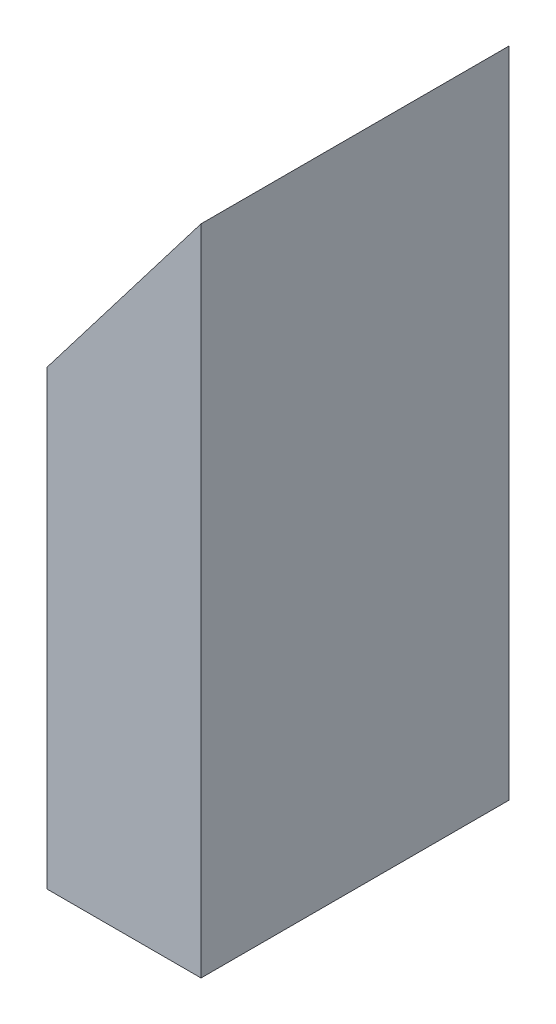
ISO-10303-21;
HEADER;
FILE_DESCRIPTION(('STEP AP214'),'2;1');
FILE_NAME('part.step','',(''),(''),'','','');
FILE_SCHEMA(('AUTOMOTIVE_DESIGN { 1 0 10303 214 1 1 1 1 }'));
ENDSEC;
DATA;
#1=APPLICATION_CONTEXT('core data for automotive mechanical design processes');
#2=APPLICATION_PROTOCOL_DEFINITION('international standard','automotive_design',2000,#1);
#3=PRODUCT_CONTEXT('',#1,'mechanical');
#4=PRODUCT('Part','Part','',(#3));
#5=PRODUCT_RELATED_PRODUCT_CATEGORY('part','',(#4));
#6=PRODUCT_DEFINITION_FORMATION('','',#4);
#7=PRODUCT_DEFINITION_CONTEXT('part definition',#1,'design');
#8=PRODUCT_DEFINITION('design','',#6,#7);
#9=PRODUCT_DEFINITION_SHAPE('','',#8);
#10=(LENGTH_UNIT() NAMED_UNIT(*) SI_UNIT(.MILLI.,.METRE.));
#11=(NAMED_UNIT(*) PLANE_ANGLE_UNIT() SI_UNIT($,.RADIAN.));
#12=(NAMED_UNIT(*) SI_UNIT($,.STERADIAN.) SOLID_ANGLE_UNIT());
#13=UNCERTAINTY_MEASURE_WITH_UNIT(LENGTH_MEASURE(1.E-05),#10,'distance_accuracy_value','');
#14=(GEOMETRIC_REPRESENTATION_CONTEXT(3) GLOBAL_UNCERTAINTY_ASSIGNED_CONTEXT((#13)) GLOBAL_UNIT_ASSIGNED_CONTEXT((#10,
#11,#12)) REPRESENTATION_CONTEXT('',''));
#15=CARTESIAN_POINT('',(0.,0.,0.));
#16=DIRECTION('',(0.,0.,1.));
#17=DIRECTION('',(1.,0.,0.));
#18=AXIS2_PLACEMENT_3D('',#15,#16,#17);
#19=CARTESIAN_POINT('',(-21.521207079583,25.2792878961904,25.4));
#20=DIRECTION('',(1.,0.,0.));
#21=DIRECTION('',(0.,1.,0.));
#22=AXIS2_PLACEMENT_3D('',#19,#20,#21);
#23=PLANE('',#22);
#24=DIRECTION('',(0.,-1.,0.));
#25=VECTOR('',#24,1.);
#26=CARTESIAN_POINT('',(-21.521207079583,25.2792878961904,0.));
#27=LINE('',#26,#25);
#28=CARTESIAN_POINT('',(-21.521207079583,25.2792878961904,0.));
#29=VERTEX_POINT('',#28);
#30=CARTESIAN_POINT('',(-21.521207079583,-11.9907870327744,0.));
#31=VERTEX_POINT('',#30);
#32=EDGE_CURVE('E114',#29,#31,#27,.T.);
#33=ORIENTED_EDGE('',*,*,#32,.T.);
#34=DIRECTION('',(0.,0.,-1.));
#35=VECTOR('',#34,1.);
#36=CARTESIAN_POINT('',(-21.521207079583,-11.9907870327744,25.4));
#37=LINE('',#36,#35);
#38=CARTESIAN_POINT('',(-21.521207079583,-11.9907870327744,25.4));
#39=VERTEX_POINT('',#38);
#40=EDGE_CURVE('E11',#39,#31,#37,.T.);
#41=ORIENTED_EDGE('',*,*,#40,.F.);
#42=DIRECTION('',(0.,-1.,0.));
#43=VECTOR('',#42,1.);
#44=CARTESIAN_POINT('',(-21.521207079583,25.2792878961904,25.4));
#45=LINE('',#44,#43);
#46=CARTESIAN_POINT('',(-21.521207079583,25.2792878961904,25.4));
#47=VERTEX_POINT('',#46);
#48=EDGE_CURVE('E115',#47,#39,#45,.T.);
#49=ORIENTED_EDGE('',*,*,#48,.F.);
#50=DIRECTION('',(0.,0.,-1.));
#51=VECTOR('',#50,1.);
#52=CARTESIAN_POINT('',(-21.521207079583,25.2792878961904,25.4));
#53=LINE('',#52,#51);
#54=EDGE_CURVE('E121',#47,#29,#53,.T.);
#55=ORIENTED_EDGE('',*,*,#54,.T.);
#56=EDGE_LOOP('',(#33,#41,#49,#55));
#57=FACE_BOUND('',#56,.T.);
#58=ADVANCED_FACE('F31',(#57),#23,.F.);
#59=CARTESIAN_POINT('',(-21.521207079583,-11.9907870327744,25.4));
#60=DIRECTION('',(0.,1.,0.));
#61=DIRECTION('',(0.,0.,1.));
#62=AXIS2_PLACEMENT_3D('',#59,#60,#61);
#63=PLANE('',#62);
#64=CARTESIAN_POINT('',(-15.1712070795824,-11.9907870327744,12.7));
#65=DIRECTION('',(0.,-1.,0.));
#66=DIRECTION('',(0.,0.,-1.));
#67=AXIS2_PLACEMENT_3D('',#64,#65,#66);
#68=CIRCLE('',#67,3.175);
#69=CARTESIAN_POINT('',(-15.1712070795824,-11.9907870327744,9.525));
#70=VERTEX_POINT('',#69);
#71=EDGE_CURVE('E95',#70,#70,#68,.T.);
#72=ORIENTED_EDGE('',*,*,#71,.F.);
#73=EDGE_LOOP('',(#72));
#74=FACE_BOUND('',#73,.T.);
#75=DIRECTION('',(1.,0.,0.));
#76=VECTOR('',#75,1.);
#77=CARTESIAN_POINT('',(-21.521207079583,-11.9907870327744,0.));
#78=LINE('',#77,#76);
#79=CARTESIAN_POINT('',(-8.81580759515179,-11.9907870327744,0.));
#80=VERTEX_POINT('',#79);
#81=EDGE_CURVE('E124',#31,#80,#78,.T.);
#82=ORIENTED_EDGE('',*,*,#81,.T.);
#83=DIRECTION('',(0.,0.,-1.));
#84=VECTOR('',#83,1.);
#85=CARTESIAN_POINT('',(-8.81580759515179,-11.9907870327744,25.4));
#86=LINE('',#85,#84);
#87=CARTESIAN_POINT('',(-8.81580759515179,-11.9907870327744,25.4));
#88=VERTEX_POINT('',#87);
#89=EDGE_CURVE('E39',#88,#80,#86,.T.);
#90=ORIENTED_EDGE('',*,*,#89,.F.);
#91=DIRECTION('',(1.,0.,0.));
#92=VECTOR('',#91,1.);
#93=CARTESIAN_POINT('',(-21.521207079583,-11.9907870327744,25.4));
#94=LINE('',#93,#92);
#95=EDGE_CURVE('E78',#39,#88,#94,.T.);
#96=ORIENTED_EDGE('',*,*,#95,.F.);
#97=ORIENTED_EDGE('',*,*,#40,.T.);
#98=EDGE_LOOP('',(#82,#90,#96,#97));
#99=FACE_BOUND('',#98,.T.);
#100=ADVANCED_FACE('F148',(#74,#99),#63,.F.);
#101=CARTESIAN_POINT('',(-8.81580759515179,-11.9907870327744,25.4));
#102=DIRECTION('',(-1.,0.,0.));
#103=DIRECTION('',(0.,-1.,0.));
#104=AXIS2_PLACEMENT_3D('',#101,#102,#103);
#105=PLANE('',#104);
#106=DIRECTION('',(0.,1.,0.));
#107=VECTOR('',#106,1.);
#108=CARTESIAN_POINT('',(-8.81580759515179,-11.9907870327744,0.));
#109=LINE('',#108,#107);
#110=CARTESIAN_POINT('',(-8.81580759515177,41.8792397509704,0.));
#111=VERTEX_POINT('',#110);
#112=EDGE_CURVE('E65',#80,#111,#109,.T.);
#113=ORIENTED_EDGE('',*,*,#112,.T.);
#114=DIRECTION('',(0.,0.,-1.));
#115=VECTOR('',#114,1.);
#116=CARTESIAN_POINT('',(-8.81580759515177,41.8792397509704,25.4));
#117=LINE('',#116,#115);
#118=CARTESIAN_POINT('',(-8.81580759515177,41.8792397509704,25.4));
#119=VERTEX_POINT('',#118);
#120=EDGE_CURVE('E129',#119,#111,#117,.T.);
#121=ORIENTED_EDGE('',*,*,#120,.F.);
#122=DIRECTION('',(0.,1.,0.));
#123=VECTOR('',#122,1.);
#124=CARTESIAN_POINT('',(-8.81580759515179,-11.9907870327744,25.4));
#125=LINE('',#124,#123);
#126=EDGE_CURVE('E118',#88,#119,#125,.T.);
#127=ORIENTED_EDGE('',*,*,#126,.F.);
#128=ORIENTED_EDGE('',*,*,#89,.T.);
#129=EDGE_LOOP('',(#113,#121,#127,#128));
#130=FACE_BOUND('',#129,.T.);
#131=ADVANCED_FACE('F131',(#130),#105,.F.);
#132=CARTESIAN_POINT('',(-8.81580759515177,41.8792397509704,25.4));
#133=DIRECTION('',(0.794096490407672,-0.607791710968666,0.));
#134=DIRECTION('',(0.607791710968666,0.794096490407672,0.));
#135=AXIS2_PLACEMENT_3D('',#132,#133,#134);
#136=PLANE('',#135);
#137=CARTESIAN_POINT('',(-16.1578182073802,32.2867021192637,12.7));
#138=DIRECTION('',(-0.794096490407672,0.607791710968666,0.));
#139=DIRECTION('',(-0.607791710968666,-0.794096490407672,0.));
#140=AXIS2_PLACEMENT_3D('',#137,#138,#139);
#141=CIRCLE('',#140,2.413);
#142=CARTESIAN_POINT('',(-17.6244196059475,30.3705472879099,12.7));
#143=VERTEX_POINT('',#142);
#144=EDGE_CURVE('E248',#143,#143,#141,.T.);
#145=ORIENTED_EDGE('',*,*,#144,.F.);
#146=EDGE_LOOP('',(#145));
#147=FACE_BOUND('',#146,.T.);
#148=DIRECTION('',(-0.607791710968666,-0.794096490407672,0.));
#149=VECTOR('',#148,1.);
#150=CARTESIAN_POINT('',(-8.81580759515177,41.8792397509704,0.));
#151=LINE('',#150,#149);
#152=EDGE_CURVE('E71',#111,#29,#151,.T.);
#153=ORIENTED_EDGE('',*,*,#152,.T.);
#154=ORIENTED_EDGE('',*,*,#54,.F.);
#155=DIRECTION('',(-0.607791710968666,-0.794096490407672,0.));
#156=VECTOR('',#155,1.);
#157=CARTESIAN_POINT('',(-8.81580759515177,41.8792397509704,25.4));
#158=LINE('',#157,#156);
#159=EDGE_CURVE('E47',#119,#47,#158,.T.);
#160=ORIENTED_EDGE('',*,*,#159,.F.);
#161=ORIENTED_EDGE('',*,*,#120,.T.);
#162=EDGE_LOOP('',(#153,#154,#160,#161));
#163=FACE_BOUND('',#162,.T.);
#164=ADVANCED_FACE('F138',(#147,#163),#136,.F.);
#165=CARTESIAN_POINT('',(-21.521207079583,-11.9907870327744,25.4));
#166=DIRECTION('',(0.,0.,1.));
#167=DIRECTION('',(1.,0.,0.));
#168=AXIS2_PLACEMENT_3D('',#165,#166,#167);
#169=PLANE('',#168);
#170=ORIENTED_EDGE('',*,*,#48,.T.);
#171=ORIENTED_EDGE('',*,*,#95,.T.);
#172=ORIENTED_EDGE('',*,*,#126,.T.);
#173=ORIENTED_EDGE('',*,*,#159,.T.);
#174=EDGE_LOOP('',(#170,#171,#172,#173));
#175=FACE_BOUND('',#174,.T.);
#176=ADVANCED_FACE('F140',(#175),#169,.T.);
#177=CARTESIAN_POINT('',(-21.521207079583,-11.9907870327744,0.));
#178=DIRECTION('',(0.,0.,1.));
#179=DIRECTION('',(1.,0.,0.));
#180=AXIS2_PLACEMENT_3D('',#177,#178,#179);
#181=PLANE('',#180);
#182=ORIENTED_EDGE('',*,*,#32,.F.);
#183=ORIENTED_EDGE('',*,*,#152,.F.);
#184=ORIENTED_EDGE('',*,*,#112,.F.);
#185=ORIENTED_EDGE('',*,*,#81,.F.);
#186=EDGE_LOOP('',(#182,#183,#184,#185));
#187=FACE_BOUND('',#186,.T.);
#188=ADVANCED_FACE('F134',(#187),#181,.F.);
#189=CARTESIAN_POINT('',(-15.1712070795824,4.51921296722563,12.7));
#190=DIRECTION('',(0.,-1.,0.));
#191=DIRECTION('',(0.,0.,-1.));
#192=AXIS2_PLACEMENT_3D('',#189,#190,#191);
#193=CONICAL_SURFACE('',#192,2.55269999999999,1.02974425867665);
#194=CARTESIAN_POINT('',(-15.1712070795824,6.05302986941728,12.7));
#195=VERTEX_POINT('',#194);
#196=VERTEX_LOOP('',#195);
#197=FACE_BOUND('',#196,.T.);
#198=CARTESIAN_POINT('',(-15.1712070795824,4.51921296722563,12.7));
#199=DIRECTION('',(0.,-1.,0.));
#200=DIRECTION('',(0.,0.,-1.));
#201=AXIS2_PLACEMENT_3D('',#198,#199,#200);
#202=CIRCLE('',#201,2.55269999999999);
#203=CARTESIAN_POINT('',(-15.1712070795824,4.51921296722563,10.1473));
#204=VERTEX_POINT('',#203);
#205=EDGE_CURVE('E111',#204,#204,#202,.T.);
#206=ORIENTED_EDGE('',*,*,#205,.T.);
#207=EDGE_LOOP('',(#206));
#208=FACE_BOUND('',#207,.T.);
#209=ADVANCED_FACE('F176',(#197,#208),#193,.F.);
#210=CARTESIAN_POINT('',(-15.1712070795824,-11.9907870327744,12.7));
#211=DIRECTION('',(0.,-1.,0.));
#212=DIRECTION('',(0.,0.,-1.));
#213=AXIS2_PLACEMENT_3D('',#210,#211,#212);
#214=CYLINDRICAL_SURFACE('',#213,2.5527);
#215=ORIENTED_EDGE('',*,*,#205,.F.);
#216=EDGE_LOOP('',(#215));
#217=FACE_BOUND('',#216,.T.);
#218=CARTESIAN_POINT('',(-15.1712070795824,0.70921296722563,12.7));
#219=DIRECTION('',(0.,-1.,0.));
#220=DIRECTION('',(0.,0.,-1.));
#221=AXIS2_PLACEMENT_3D('',#218,#219,#220);
#222=CIRCLE('',#221,2.5527);
#223=CARTESIAN_POINT('',(-15.1712070795824,0.70921296722563,10.1473));
#224=VERTEX_POINT('',#223);
#225=EDGE_CURVE('E108',#224,#224,#222,.T.);
#226=ORIENTED_EDGE('',*,*,#225,.T.);
#227=EDGE_LOOP('',(#226));
#228=FACE_BOUND('',#227,.T.);
#229=ADVANCED_FACE('F168',(#217,#228),#214,.F.);
#230=CARTESIAN_POINT('',(-12.6185070795824,0.70921296722563,12.7));
#231=DIRECTION('',(0.,1.,0.));
#232=DIRECTION('',(0.,0.,1.));
#233=AXIS2_PLACEMENT_3D('',#230,#231,#232);
#234=PLANE('',#233);
#235=ORIENTED_EDGE('',*,*,#225,.F.);
#236=EDGE_LOOP('',(#235));
#237=FACE_BOUND('',#236,.T.);
#238=CARTESIAN_POINT('',(-15.1712070795824,0.70921296722563,12.7));
#239=DIRECTION('',(0.,-1.,0.));
#240=DIRECTION('',(0.,0.,-1.));
#241=AXIS2_PLACEMENT_3D('',#238,#239,#240);
#242=CIRCLE('',#241,3.175);
#243=CARTESIAN_POINT('',(-15.1712070795824,0.70921296722563,9.525));
#244=VERTEX_POINT('',#243);
#245=EDGE_CURVE('E99',#244,#244,#242,.T.);
#246=ORIENTED_EDGE('',*,*,#245,.T.);
#247=EDGE_LOOP('',(#246));
#248=FACE_BOUND('',#247,.T.);
#249=ADVANCED_FACE('F162',(#237,#248),#234,.F.);
#250=CARTESIAN_POINT('',(-15.1712070795824,-11.9907870327744,12.7));
#251=DIRECTION('',(0.,-1.,0.));
#252=DIRECTION('',(0.,0.,-1.));
#253=AXIS2_PLACEMENT_3D('',#250,#251,#252);
#254=CYLINDRICAL_SURFACE('',#253,3.175);
#255=ORIENTED_EDGE('',*,*,#245,.F.);
#256=EDGE_LOOP('',(#255));
#257=FACE_BOUND('',#256,.T.);
#258=ORIENTED_EDGE('',*,*,#71,.T.);
#259=EDGE_LOOP('',(#258));
#260=FACE_BOUND('',#259,.T.);
#261=ADVANCED_FACE('F89',(#257,#260),#254,.F.);
#262=CARTESIAN_POINT('',(-11.1153054932914,28.4272247546126,12.7));
#263=DIRECTION('',(-0.794096490407672,0.607791710968666,0.));
#264=DIRECTION('',(-0.607791710968666,-0.794096490407672,0.));
#265=AXIS2_PLACEMENT_3D('',#262,#263,#264);
#266=CONICAL_SURFACE('',#265,1.89865,1.02974425867665);
#267=CARTESIAN_POINT('',(-10.2093811473498,27.733841375037,12.7));
#268=VERTEX_POINT('',#267);
#269=VERTEX_LOOP('',#268);
#270=FACE_BOUND('',#269,.T.);
#271=CARTESIAN_POINT('',(-11.1153054932914,28.4272247546126,12.7));
#272=DIRECTION('',(-0.794096490407672,0.607791710968666,0.));
#273=DIRECTION('',(-0.607791710968666,-0.794096490407672,0.));
#274=AXIS2_PLACEMENT_3D('',#271,#272,#273);
#275=CIRCLE('',#274,1.89865);
#276=CARTESIAN_POINT('',(-12.2692892253221,26.9195134531001,12.7));
#277=VERTEX_POINT('',#276);
#278=EDGE_CURVE('E93',#277,#277,#275,.T.);
#279=ORIENTED_EDGE('',*,*,#278,.T.);
#280=EDGE_LOOP('',(#279));
#281=FACE_BOUND('',#280,.T.);
#282=ADVANCED_FACE('F85',(#270,#281),#266,.F.);
#283=CARTESIAN_POINT('',(-16.1578182073802,32.2867021192637,12.7));
#284=DIRECTION('',(-0.794096490407672,0.607791710968666,0.));
#285=DIRECTION('',(-0.607791710968666,-0.794096490407672,0.));
#286=AXIS2_PLACEMENT_3D('',#283,#284,#285);
#287=CYLINDRICAL_SURFACE('',#286,1.89865);
#288=ORIENTED_EDGE('',*,*,#278,.F.);
#289=EDGE_LOOP('',(#288));
#290=FACE_BOUND('',#289,.T.);
#291=CARTESIAN_POINT('',(-13.6365618503358,30.3569634369381,12.7));
#292=DIRECTION('',(-0.794096490407672,0.607791710968666,0.));
#293=DIRECTION('',(-0.607791710968666,-0.794096490407672,0.));
#294=AXIS2_PLACEMENT_3D('',#291,#292,#293);
#295=CIRCLE('',#294,1.89865);
#296=CARTESIAN_POINT('',(-14.7905455823664,28.8492521354256,12.7));
#297=VERTEX_POINT('',#296);
#298=EDGE_CURVE('E96',#297,#297,#295,.T.);
#299=ORIENTED_EDGE('',*,*,#298,.T.);
#300=EDGE_LOOP('',(#299));
#301=FACE_BOUND('',#300,.T.);
#302=ADVANCED_FACE('F88',(#290,#301),#287,.F.);
#303=CARTESIAN_POINT('',(-13.6365618503358,30.3569634369381,14.59865));
#304=DIRECTION('',(0.794096490407672,-0.607791710968666,0.));
#305=DIRECTION('',(0.607791710968666,0.794096490407672,0.));
#306=AXIS2_PLACEMENT_3D('',#303,#304,#305);
#307=PLANE('',#306);
#308=ORIENTED_EDGE('',*,*,#298,.F.);
#309=EDGE_LOOP('',(#308));
#310=FACE_BOUND('',#309,.T.);
#311=CARTESIAN_POINT('',(-13.6365618503358,30.3569634369381,12.7));
#312=DIRECTION('',(-0.794096490407672,0.607791710968666,0.));
#313=DIRECTION('',(-0.607791710968666,-0.794096490407672,0.));
#314=AXIS2_PLACEMENT_3D('',#311,#312,#313);
#315=CIRCLE('',#314,2.413);
#316=CARTESIAN_POINT('',(-15.1031632489032,28.4408086055844,12.7));
#317=VERTEX_POINT('',#316);
#318=EDGE_CURVE('E102',#317,#317,#315,.T.);
#319=ORIENTED_EDGE('',*,*,#318,.T.);
#320=EDGE_LOOP('',(#319));
#321=FACE_BOUND('',#320,.T.);
#322=ADVANCED_FACE('F222',(#310,#321),#307,.F.);
#323=CARTESIAN_POINT('',(-16.1578182073802,32.2867021192637,12.7));
#324=DIRECTION('',(-0.794096490407672,0.607791710968666,0.));
#325=DIRECTION('',(-0.607791710968666,-0.794096490407672,0.));
#326=AXIS2_PLACEMENT_3D('',#323,#324,#325);
#327=CYLINDRICAL_SURFACE('',#326,2.413);
#328=ORIENTED_EDGE('',*,*,#318,.F.);
#329=EDGE_LOOP('',(#328));
#330=FACE_BOUND('',#329,.T.);
#331=ORIENTED_EDGE('',*,*,#144,.T.);
#332=EDGE_LOOP('',(#331));
#333=FACE_BOUND('',#332,.T.);
#334=ADVANCED_FACE('F230',(#330,#333),#327,.F.);
#335=CLOSED_SHELL('',(#58,#100,#131,#164,#176,#188,#209,#229,#249,#261,#282,#302,#322,#334));
#336=MANIFOLD_SOLID_BREP('B2',#335);
#337=ADVANCED_BREP_SHAPE_REPRESENTATION('',(#18,#336),#14);
#338=SHAPE_DEFINITION_REPRESENTATION(#9,#337);
ENDSEC;
END-ISO-10303-21;
